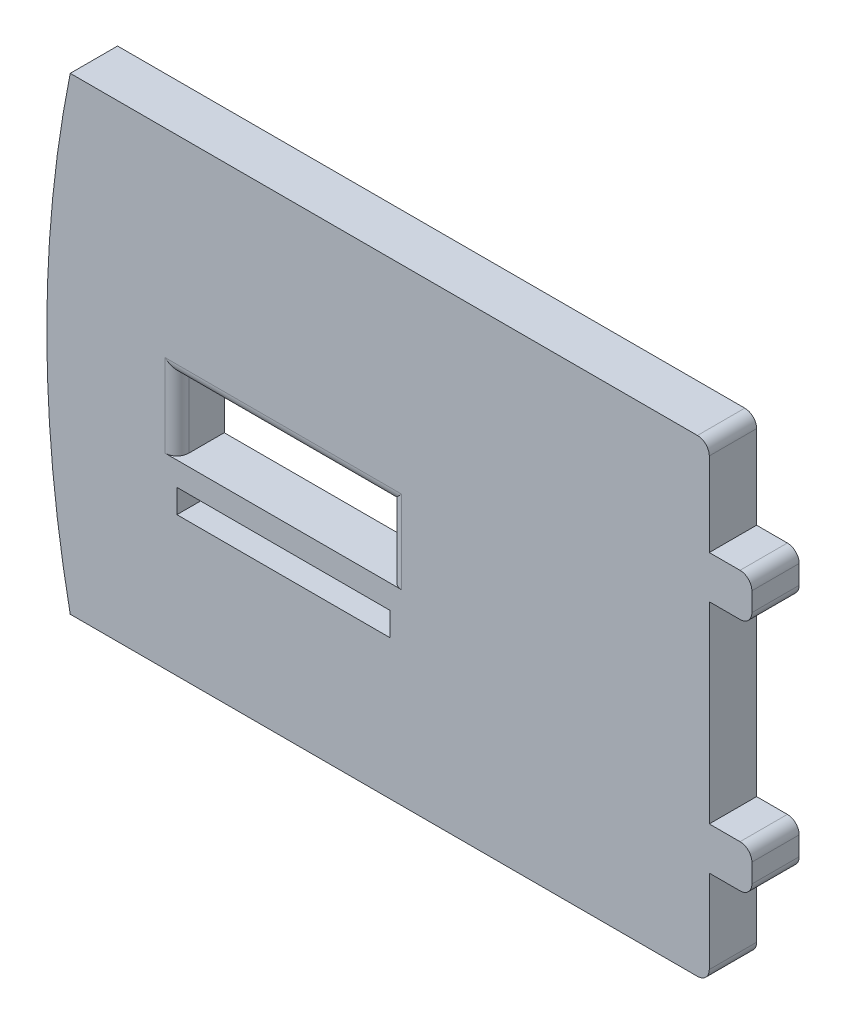
ISO-10303-21;
HEADER;
FILE_DESCRIPTION(('STEP AP214'),'2;1');
FILE_NAME('part.step','',(''),(''),'','','');
FILE_SCHEMA(('AUTOMOTIVE_DESIGN { 1 0 10303 214 1 1 1 1 }'));
ENDSEC;
DATA;
#1=APPLICATION_CONTEXT('core data for automotive mechanical design processes');
#2=APPLICATION_PROTOCOL_DEFINITION('international standard','automotive_design',2000,#1);
#3=PRODUCT_CONTEXT('',#1,'mechanical');
#4=PRODUCT('Part','Part','',(#3));
#5=PRODUCT_RELATED_PRODUCT_CATEGORY('part','',(#4));
#6=PRODUCT_DEFINITION_FORMATION('','',#4);
#7=PRODUCT_DEFINITION_CONTEXT('part definition',#1,'design');
#8=PRODUCT_DEFINITION('design','',#6,#7);
#9=PRODUCT_DEFINITION_SHAPE('','',#8);
#10=(LENGTH_UNIT() NAMED_UNIT(*) SI_UNIT(.MILLI.,.METRE.));
#11=(NAMED_UNIT(*) PLANE_ANGLE_UNIT() SI_UNIT($,.RADIAN.));
#12=(NAMED_UNIT(*) SI_UNIT($,.STERADIAN.) SOLID_ANGLE_UNIT());
#13=UNCERTAINTY_MEASURE_WITH_UNIT(LENGTH_MEASURE(1.E-05),#10,'distance_accuracy_value','');
#14=(GEOMETRIC_REPRESENTATION_CONTEXT(3) GLOBAL_UNCERTAINTY_ASSIGNED_CONTEXT((#13)) GLOBAL_UNIT_ASSIGNED_CONTEXT((#10,
#11,#12)) REPRESENTATION_CONTEXT('',''));
#15=CARTESIAN_POINT('',(0.,0.,0.));
#16=DIRECTION('',(0.,0.,1.));
#17=DIRECTION('',(1.,0.,0.));
#18=AXIS2_PLACEMENT_3D('',#15,#16,#17);
#19=CARTESIAN_POINT('',(-22.,0.,-2.));
#20=DIRECTION('',(-1.,0.,0.));
#21=DIRECTION('',(0.,0.,1.));
#22=AXIS2_PLACEMENT_3D('',#19,#20,#21);
#23=PLANE('',#22);
#24=DIRECTION('',(0.,-1.,0.));
#25=VECTOR('',#24,1.);
#26=CARTESIAN_POINT('',(-22.,0.,0.));
#27=LINE('',#26,#25);
#28=CARTESIAN_POINT('',(-22.,-5.86910715478513,0.));
#29=VERTEX_POINT('',#28);
#30=CARTESIAN_POINT('',(-22.,-9.4,0.));
#31=VERTEX_POINT('',#30);
#32=EDGE_CURVE('E247',#29,#31,#27,.T.);
#33=ORIENTED_EDGE('',*,*,#32,.T.);
#34=DIRECTION('',(0.,0.,1.));
#35=VECTOR('',#34,1.);
#36=CARTESIAN_POINT('',(-22.,-9.4,-2.));
#37=LINE('',#36,#35);
#38=CARTESIAN_POINT('',(-22.,-9.4,-2.));
#39=VERTEX_POINT('',#38);
#40=EDGE_CURVE('E69',#31,#39,#37,.F.);
#41=ORIENTED_EDGE('',*,*,#40,.T.);
#42=DIRECTION('',(0.,-1.,0.));
#43=VECTOR('',#42,1.);
#44=CARTESIAN_POINT('',(-22.,0.,-2.));
#45=LINE('',#44,#43);
#46=CARTESIAN_POINT('',(-22.,-5.86910715478513,-2.));
#47=VERTEX_POINT('',#46);
#48=EDGE_CURVE('E248',#47,#39,#45,.T.);
#49=ORIENTED_EDGE('',*,*,#48,.F.);
#50=DIRECTION('',(0.,0.,-1.));
#51=VECTOR('',#50,1.);
#52=CARTESIAN_POINT('',(-22.,-5.86910715478513,0.));
#53=LINE('',#52,#51);
#54=EDGE_CURVE('E237',#29,#47,#53,.T.);
#55=ORIENTED_EDGE('',*,*,#54,.F.);
#56=EDGE_LOOP('',(#33,#41,#49,#55));
#57=FACE_BOUND('',#56,.T.);
#58=ADVANCED_FACE('F43',(#57),#23,.F.);
#59=CARTESIAN_POINT('',(-22.,4.06420177177684,0.));
#60=VERTEX_POINT('',#59);
#61=CARTESIAN_POINT('',(-22.,-4.06910715478513,0.));
#62=VERTEX_POINT('',#61);
#63=EDGE_CURVE('E257',#60,#62,#27,.T.);
#64=ORIENTED_EDGE('',*,*,#63,.T.);
#65=DIRECTION('',(0.,0.,-1.));
#66=VECTOR('',#65,1.);
#67=CARTESIAN_POINT('',(-22.,-4.06910715478513,0.));
#68=LINE('',#67,#66);
#69=CARTESIAN_POINT('',(-22.,-4.06910715478513,-2.));
#70=VERTEX_POINT('',#69);
#71=EDGE_CURVE('E250',#62,#70,#68,.T.);
#72=ORIENTED_EDGE('',*,*,#71,.T.);
#73=CARTESIAN_POINT('',(-22.,4.06420177177684,-2.));
#74=VERTEX_POINT('',#73);
#75=EDGE_CURVE('E504',#74,#70,#45,.T.);
#76=ORIENTED_EDGE('',*,*,#75,.F.);
#77=DIRECTION('',(0.,0.,-1.));
#78=VECTOR('',#77,1.);
#79=CARTESIAN_POINT('',(-22.,4.06420177177684,0.));
#80=LINE('',#79,#78);
#81=EDGE_CURVE('E244',#60,#74,#80,.T.);
#82=ORIENTED_EDGE('',*,*,#81,.F.);
#83=EDGE_LOOP('',(#64,#72,#76,#82));
#84=FACE_BOUND('',#83,.T.);
#85=ADVANCED_FACE('F560',(#84),#23,.F.);
#86=CARTESIAN_POINT('',(0.,0.,0.));
#87=DIRECTION('',(0.,0.,1.));
#88=DIRECTION('',(1.,0.,0.));
#89=AXIS2_PLACEMENT_3D('',#86,#87,#88);
#90=PLANE('',#89);
#91=DIRECTION('',(0.,-1.,0.));
#92=VECTOR('',#91,1.);
#93=CARTESIAN_POINT('',(-35.,-2.00000000000001,0.));
#94=LINE('',#93,#92);
#95=CARTESIAN_POINT('',(-35.,1.5,0.));
#96=VERTEX_POINT('',#95);
#97=CARTESIAN_POINT('',(-35.,-2.00000000000001,0.));
#98=VERTEX_POINT('',#97);
#99=EDGE_CURVE('E324',#96,#98,#94,.T.);
#100=ORIENTED_EDGE('',*,*,#99,.T.);
#101=DIRECTION('',(-1.,0.,0.));
#102=VECTOR('',#101,1.);
#103=CARTESIAN_POINT('',(-44.5,-2.,0.));
#104=LINE('',#103,#102);
#105=CARTESIAN_POINT('',(-45.,-2.,0.));
#106=VERTEX_POINT('',#105);
#107=EDGE_CURVE('E429',#98,#106,#104,.T.);
#108=ORIENTED_EDGE('',*,*,#107,.T.);
#109=DIRECTION('',(0.,1.,0.));
#110=VECTOR('',#109,1.);
#111=CARTESIAN_POINT('',(-45.,0.999999999999996,0.));
#112=LINE('',#111,#110);
#113=CARTESIAN_POINT('',(-45.,1.5,0.));
#114=VERTEX_POINT('',#113);
#115=EDGE_CURVE('E321',#106,#114,#112,.T.);
#116=ORIENTED_EDGE('',*,*,#115,.T.);
#117=DIRECTION('',(1.,0.,0.));
#118=VECTOR('',#117,1.);
#119=CARTESIAN_POINT('',(-35.5,1.5,0.));
#120=LINE('',#119,#118);
#121=EDGE_CURVE('E318',#114,#96,#120,.T.);
#122=ORIENTED_EDGE('',*,*,#121,.T.);
#123=EDGE_LOOP('',(#100,#108,#116,#122));
#124=FACE_BOUND('',#123,.T.);
#125=DIRECTION('',(-1.,0.,0.));
#126=VECTOR('',#125,1.);
#127=CARTESIAN_POINT('',(-35.5,-4.,0.));
#128=LINE('',#127,#126);
#129=CARTESIAN_POINT('',(-35.5,-4.,0.));
#130=VERTEX_POINT('',#129);
#131=CARTESIAN_POINT('',(-44.5,-4.00000000000001,0.));
#132=VERTEX_POINT('',#131);
#133=EDGE_CURVE('E458',#130,#132,#128,.T.);
#134=ORIENTED_EDGE('',*,*,#133,.T.);
#135=DIRECTION('',(0.,1.,0.));
#136=VECTOR('',#135,1.);
#137=CARTESIAN_POINT('',(-44.5,-4.00000000000001,0.));
#138=LINE('',#137,#136);
#139=CARTESIAN_POINT('',(-44.5,-3.00000000000001,0.));
#140=VERTEX_POINT('',#139);
#141=EDGE_CURVE('E462',#132,#140,#138,.T.);
#142=ORIENTED_EDGE('',*,*,#141,.T.);
#143=DIRECTION('',(1.,0.,0.));
#144=VECTOR('',#143,1.);
#145=CARTESIAN_POINT('',(-44.5,-3.00000000000001,0.));
#146=LINE('',#145,#144);
#147=CARTESIAN_POINT('',(-35.5,-3.00000000000001,0.));
#148=VERTEX_POINT('',#147);
#149=EDGE_CURVE('E467',#140,#148,#146,.T.);
#150=ORIENTED_EDGE('',*,*,#149,.T.);
#151=DIRECTION('',(0.,-1.,0.));
#152=VECTOR('',#151,1.);
#153=CARTESIAN_POINT('',(-35.5,-3.00000000000001,0.));
#154=LINE('',#153,#152);
#155=EDGE_CURVE('E471',#148,#130,#154,.T.);
#156=ORIENTED_EDGE('',*,*,#155,.T.);
#157=EDGE_LOOP('',(#134,#142,#150,#156));
#158=FACE_BOUND('',#157,.T.);
#159=DIRECTION('',(0.,-1.,0.));
#160=VECTOR('',#159,1.);
#161=CARTESIAN_POINT('',(-20.2,0.,0.));
#162=LINE('',#161,#160);
#163=CARTESIAN_POINT('',(-20.2,-4.56910715478513,0.));
#164=VERTEX_POINT('',#163);
#165=CARTESIAN_POINT('',(-20.2,-5.36910715478513,0.));
#166=VERTEX_POINT('',#165);
#167=EDGE_CURVE('E575',#164,#166,#162,.T.);
#168=ORIENTED_EDGE('',*,*,#167,.F.);
#169=CARTESIAN_POINT('',(-20.7,-4.56910715478513,0.));
#170=DIRECTION('',(0.,0.,1.));
#171=DIRECTION('',(1.,0.,0.));
#172=AXIS2_PLACEMENT_3D('',#169,#170,#171);
#173=CIRCLE('',#172,0.5);
#174=CARTESIAN_POINT('',(-20.7,-4.06910715478513,0.));
#175=VERTEX_POINT('',#174);
#176=EDGE_CURVE('E315',#164,#175,#173,.T.);
#177=ORIENTED_EDGE('',*,*,#176,.T.);
#178=DIRECTION('',(-1.,0.,0.));
#179=VECTOR('',#178,1.);
#180=CARTESIAN_POINT('',(-20.2,-4.06910715478513,0.));
#181=LINE('',#180,#179);
#182=EDGE_CURVE('E564',#175,#62,#181,.T.);
#183=ORIENTED_EDGE('',*,*,#182,.T.);
#184=ORIENTED_EDGE('',*,*,#63,.F.);
#185=DIRECTION('',(-1.,0.,0.));
#186=VECTOR('',#185,1.);
#187=CARTESIAN_POINT('',(-20.2,4.06420177177684,0.));
#188=LINE('',#187,#186);
#189=CARTESIAN_POINT('',(-20.7,4.06420177177684,0.));
#190=VERTEX_POINT('',#189);
#191=EDGE_CURVE('E480',#190,#60,#188,.T.);
#192=ORIENTED_EDGE('',*,*,#191,.F.);
#193=CARTESIAN_POINT('',(-20.7,4.56420177177684,0.));
#194=DIRECTION('',(0.,0.,1.));
#195=DIRECTION('',(1.,0.,0.));
#196=AXIS2_PLACEMENT_3D('',#193,#194,#195);
#197=CIRCLE('',#196,0.5);
#198=CARTESIAN_POINT('',(-20.2,4.56420177177684,0.));
#199=VERTEX_POINT('',#198);
#200=EDGE_CURVE('E307',#190,#199,#197,.T.);
#201=ORIENTED_EDGE('',*,*,#200,.T.);
#202=DIRECTION('',(0.,-1.,0.));
#203=VECTOR('',#202,1.);
#204=CARTESIAN_POINT('',(-20.2,0.,0.));
#205=LINE('',#204,#203);
#206=CARTESIAN_POINT('',(-20.2,5.36420177177684,0.));
#207=VERTEX_POINT('',#206);
#208=EDGE_CURVE('E530',#207,#199,#205,.T.);
#209=ORIENTED_EDGE('',*,*,#208,.F.);
#210=CARTESIAN_POINT('',(-20.7,5.36420177177684,0.));
#211=DIRECTION('',(0.,0.,1.));
#212=DIRECTION('',(1.,0.,0.));
#213=AXIS2_PLACEMENT_3D('',#210,#211,#212);
#214=CIRCLE('',#213,0.5);
#215=CARTESIAN_POINT('',(-20.7,5.86420177177684,0.));
#216=VERTEX_POINT('',#215);
#217=EDGE_CURVE('E304',#207,#216,#214,.T.);
#218=ORIENTED_EDGE('',*,*,#217,.T.);
#219=DIRECTION('',(-1.,0.,0.));
#220=VECTOR('',#219,1.);
#221=CARTESIAN_POINT('',(-20.2,5.86420177177684,0.));
#222=LINE('',#221,#220);
#223=CARTESIAN_POINT('',(-22.,5.86420177177684,0.));
#224=VERTEX_POINT('',#223);
#225=EDGE_CURVE('E541',#216,#224,#222,.T.);
#226=ORIENTED_EDGE('',*,*,#225,.T.);
#227=CARTESIAN_POINT('',(-22.,9.4,0.));
#228=VERTEX_POINT('',#227);
#229=EDGE_CURVE('E260',#228,#224,#27,.T.);
#230=ORIENTED_EDGE('',*,*,#229,.F.);
#231=CARTESIAN_POINT('',(-22.5,9.4,0.));
#232=DIRECTION('',(0.,0.,1.));
#233=DIRECTION('',(1.,0.,0.));
#234=AXIS2_PLACEMENT_3D('',#231,#232,#233);
#235=CIRCLE('',#234,0.5);
#236=CARTESIAN_POINT('',(-22.5,9.9,0.));
#237=VERTEX_POINT('',#236);
#238=EDGE_CURVE('E298',#228,#237,#235,.T.);
#239=ORIENTED_EDGE('',*,*,#238,.T.);
#240=DIRECTION('',(-1.,0.,0.));
#241=VECTOR('',#240,1.);
#242=CARTESIAN_POINT('',(0.,9.9,0.));
#243=LINE('',#242,#241);
#244=CARTESIAN_POINT('',(-49.0101009996919,9.9,0.));
#245=VERTEX_POINT('',#244);
#246=EDGE_CURVE('E277',#237,#245,#243,.T.);
#247=ORIENTED_EDGE('',*,*,#246,.T.);
#248=CARTESIAN_POINT('',(0.,0.,0.));
#249=DIRECTION('',(0.,0.,1.));
#250=DIRECTION('',(1.,0.,0.));
#251=AXIS2_PLACEMENT_3D('',#248,#249,#250);
#252=CIRCLE('',#251,50.);
#253=CARTESIAN_POINT('',(-49.0101009996919,-9.9,0.));
#254=VERTEX_POINT('',#253);
#255=EDGE_CURVE('E294',#245,#254,#252,.T.);
#256=ORIENTED_EDGE('',*,*,#255,.T.);
#257=DIRECTION('',(-1.,0.,0.));
#258=VECTOR('',#257,1.);
#259=CARTESIAN_POINT('',(0.,-9.9,0.));
#260=LINE('',#259,#258);
#261=CARTESIAN_POINT('',(-22.5,-9.9,0.));
#262=VERTEX_POINT('',#261);
#263=EDGE_CURVE('E270',#262,#254,#260,.T.);
#264=ORIENTED_EDGE('',*,*,#263,.F.);
#265=CARTESIAN_POINT('',(-22.5,-9.4,0.));
#266=DIRECTION('',(0.,0.,1.));
#267=DIRECTION('',(1.,0.,0.));
#268=AXIS2_PLACEMENT_3D('',#265,#266,#267);
#269=CIRCLE('',#268,0.5);
#270=EDGE_CURVE('E255',#262,#31,#269,.T.);
#271=ORIENTED_EDGE('',*,*,#270,.T.);
#272=ORIENTED_EDGE('',*,*,#32,.F.);
#273=DIRECTION('',(-1.,0.,0.));
#274=VECTOR('',#273,1.);
#275=CARTESIAN_POINT('',(-20.2,-5.86910715478513,0.));
#276=LINE('',#275,#274);
#277=CARTESIAN_POINT('',(-20.7,-5.86910715478513,0.));
#278=VERTEX_POINT('',#277);
#279=EDGE_CURVE('E233',#278,#29,#276,.T.);
#280=ORIENTED_EDGE('',*,*,#279,.F.);
#281=CARTESIAN_POINT('',(-20.7,-5.36910715478513,0.));
#282=DIRECTION('',(0.,0.,1.));
#283=DIRECTION('',(1.,0.,0.));
#284=AXIS2_PLACEMENT_3D('',#281,#282,#283);
#285=CIRCLE('',#284,0.5);
#286=EDGE_CURVE('E312',#278,#166,#285,.T.);
#287=ORIENTED_EDGE('',*,*,#286,.T.);
#288=EDGE_LOOP('',(#168,#177,#183,#184,#192,#201,#209,#218,#226,#230,#239,#247,#256,#264,#271,
#272,#280,#287));
#289=FACE_BOUND('',#288,.T.);
#290=ADVANCED_FACE('F253',(#124,#158,#289),#90,.T.);
#291=CARTESIAN_POINT('',(0.,0.,-2.));
#292=DIRECTION('',(0.,0.,1.));
#293=DIRECTION('',(1.,0.,0.));
#294=AXIS2_PLACEMENT_3D('',#291,#292,#293);
#295=CYLINDRICAL_SURFACE('',#294,50.);
#296=ORIENTED_EDGE('',*,*,#255,.F.);
#297=DIRECTION('',(0.,0.,1.));
#298=VECTOR('',#297,1.);
#299=CARTESIAN_POINT('',(-49.0101009996919,9.9,-2.));
#300=LINE('',#299,#298);
#301=CARTESIAN_POINT('',(-49.0101009996919,9.9,-2.));
#302=VERTEX_POINT('',#301);
#303=EDGE_CURVE('E285',#302,#245,#300,.T.);
#304=ORIENTED_EDGE('',*,*,#303,.F.);
#305=CARTESIAN_POINT('',(0.,0.,-2.));
#306=DIRECTION('',(0.,0.,1.));
#307=DIRECTION('',(1.,0.,0.));
#308=AXIS2_PLACEMENT_3D('',#305,#306,#307);
#309=CIRCLE('',#308,50.);
#310=CARTESIAN_POINT('',(-49.0101009996919,-9.9,-2.));
#311=VERTEX_POINT('',#310);
#312=EDGE_CURVE('E289',#302,#311,#309,.T.);
#313=ORIENTED_EDGE('',*,*,#312,.T.);
#314=DIRECTION('',(0.,0.,1.));
#315=VECTOR('',#314,1.);
#316=CARTESIAN_POINT('',(-49.0101009996919,-9.9,-2.));
#317=LINE('',#316,#315);
#318=EDGE_CURVE('E290',#311,#254,#317,.T.);
#319=ORIENTED_EDGE('',*,*,#318,.T.);
#320=EDGE_LOOP('',(#296,#304,#313,#319));
#321=FACE_BOUND('',#320,.T.);
#322=ADVANCED_FACE('F517',(#321),#295,.T.);
#323=CARTESIAN_POINT('',(0.,0.,-2.));
#324=DIRECTION('',(0.,0.,1.));
#325=DIRECTION('',(1.,0.,0.));
#326=AXIS2_PLACEMENT_3D('',#323,#324,#325);
#327=PLANE('',#326);
#328=DIRECTION('',(1.,0.,0.));
#329=VECTOR('',#328,1.);
#330=CARTESIAN_POINT('',(-35.5,0.999999999999996,-2.));
#331=LINE('',#330,#329);
#332=CARTESIAN_POINT('',(-44.5,0.999999999999996,-2.));
#333=VERTEX_POINT('',#332);
#334=CARTESIAN_POINT('',(-35.5,0.999999999999996,-2.));
#335=VERTEX_POINT('',#334);
#336=EDGE_CURVE('E437',#333,#335,#331,.T.);
#337=ORIENTED_EDGE('',*,*,#336,.F.);
#338=DIRECTION('',(0.,1.,0.));
#339=VECTOR('',#338,1.);
#340=CARTESIAN_POINT('',(-44.5,0.999999999999996,-2.));
#341=LINE('',#340,#339);
#342=CARTESIAN_POINT('',(-44.5,-2.,-2.));
#343=VERTEX_POINT('',#342);
#344=EDGE_CURVE('E433',#343,#333,#341,.T.);
#345=ORIENTED_EDGE('',*,*,#344,.F.);
#346=DIRECTION('',(-1.,0.,0.));
#347=VECTOR('',#346,1.);
#348=CARTESIAN_POINT('',(-44.5,-2.,-2.));
#349=LINE('',#348,#347);
#350=CARTESIAN_POINT('',(-35.5,-2.00000000000001,-2.));
#351=VERTEX_POINT('',#350);
#352=EDGE_CURVE('E422',#351,#343,#349,.T.);
#353=ORIENTED_EDGE('',*,*,#352,.F.);
#354=DIRECTION('',(0.,-1.,0.));
#355=VECTOR('',#354,1.);
#356=CARTESIAN_POINT('',(-35.5,-2.00000000000001,-2.));
#357=LINE('',#356,#355);
#358=EDGE_CURVE('E430',#335,#351,#357,.T.);
#359=ORIENTED_EDGE('',*,*,#358,.F.);
#360=EDGE_LOOP('',(#337,#345,#353,#359));
#361=FACE_BOUND('',#360,.T.);
#362=DIRECTION('',(0.,1.,0.));
#363=VECTOR('',#362,1.);
#364=CARTESIAN_POINT('',(-44.5,-4.00000000000001,-2.));
#365=LINE('',#364,#363);
#366=CARTESIAN_POINT('',(-44.5,-4.00000000000001,-2.));
#367=VERTEX_POINT('',#366);
#368=CARTESIAN_POINT('',(-44.5,-3.00000000000001,-2.));
#369=VERTEX_POINT('',#368);
#370=EDGE_CURVE('E479',#367,#369,#365,.T.);
#371=ORIENTED_EDGE('',*,*,#370,.F.);
#372=DIRECTION('',(-1.,0.,0.));
#373=VECTOR('',#372,1.);
#374=CARTESIAN_POINT('',(-35.5,-4.,-2.));
#375=LINE('',#374,#373);
#376=CARTESIAN_POINT('',(-35.5,-4.,-2.));
#377=VERTEX_POINT('',#376);
#378=EDGE_CURVE('E476',#377,#367,#375,.T.);
#379=ORIENTED_EDGE('',*,*,#378,.F.);
#380=DIRECTION('',(0.,-1.,0.));
#381=VECTOR('',#380,1.);
#382=CARTESIAN_POINT('',(-35.5,-3.00000000000001,-2.));
#383=LINE('',#382,#381);
#384=CARTESIAN_POINT('',(-35.5,-3.00000000000001,-2.));
#385=VERTEX_POINT('',#384);
#386=EDGE_CURVE('E463',#385,#377,#383,.T.);
#387=ORIENTED_EDGE('',*,*,#386,.F.);
#388=DIRECTION('',(1.,0.,0.));
#389=VECTOR('',#388,1.);
#390=CARTESIAN_POINT('',(-44.5,-3.00000000000001,-2.));
#391=LINE('',#390,#389);
#392=EDGE_CURVE('E484',#369,#385,#391,.T.);
#393=ORIENTED_EDGE('',*,*,#392,.F.);
#394=EDGE_LOOP('',(#371,#379,#387,#393));
#395=FACE_BOUND('',#394,.T.);
#396=DIRECTION('',(-1.,0.,0.));
#397=VECTOR('',#396,1.);
#398=CARTESIAN_POINT('',(-20.2,-4.06910715478513,-2.));
#399=LINE('',#398,#397);
#400=CARTESIAN_POINT('',(-20.7,-4.06910715478513,-2.));
#401=VERTEX_POINT('',#400);
#402=EDGE_CURVE('E570',#401,#70,#399,.T.);
#403=ORIENTED_EDGE('',*,*,#402,.F.);
#404=CARTESIAN_POINT('',(-20.7,-4.56910715478513,-2.));
#405=DIRECTION('',(0.,0.,1.));
#406=DIRECTION('',(1.,0.,0.));
#407=AXIS2_PLACEMENT_3D('',#404,#405,#406);
#408=CIRCLE('',#407,0.5);
#409=CARTESIAN_POINT('',(-20.2,-4.56910715478513,-2.));
#410=VERTEX_POINT('',#409);
#411=EDGE_CURVE('E355',#401,#410,#408,.F.);
#412=ORIENTED_EDGE('',*,*,#411,.T.);
#413=DIRECTION('',(0.,1.,0.));
#414=VECTOR('',#413,1.);
#415=CARTESIAN_POINT('',(-20.2,0.,-2.));
#416=LINE('',#415,#414);
#417=CARTESIAN_POINT('',(-20.2,-5.36910715478513,-2.));
#418=VERTEX_POINT('',#417);
#419=EDGE_CURVE('E571',#418,#410,#416,.T.);
#420=ORIENTED_EDGE('',*,*,#419,.F.);
#421=CARTESIAN_POINT('',(-20.7,-5.36910715478513,-2.));
#422=DIRECTION('',(0.,0.,1.));
#423=DIRECTION('',(1.,0.,0.));
#424=AXIS2_PLACEMENT_3D('',#421,#422,#423);
#425=CIRCLE('',#424,0.5);
#426=CARTESIAN_POINT('',(-20.7,-5.86910715478513,-2.));
#427=VERTEX_POINT('',#426);
#428=EDGE_CURVE('E352',#418,#427,#425,.F.);
#429=ORIENTED_EDGE('',*,*,#428,.T.);
#430=DIRECTION('',(-1.,0.,0.));
#431=VECTOR('',#430,1.);
#432=CARTESIAN_POINT('',(-20.2,-5.86910715478513,-2.));
#433=LINE('',#432,#431);
#434=EDGE_CURVE('E245',#427,#47,#433,.T.);
#435=ORIENTED_EDGE('',*,*,#434,.T.);
#436=ORIENTED_EDGE('',*,*,#48,.T.);
#437=CARTESIAN_POINT('',(-22.5,-9.4,-2.));
#438=DIRECTION('',(0.,0.,1.));
#439=DIRECTION('',(1.,0.,0.));
#440=AXIS2_PLACEMENT_3D('',#437,#438,#439);
#441=CIRCLE('',#440,0.5);
#442=CARTESIAN_POINT('',(-22.5,-9.9,-2.));
#443=VERTEX_POINT('',#442);
#444=EDGE_CURVE('E61',#39,#443,#441,.F.);
#445=ORIENTED_EDGE('',*,*,#444,.T.);
#446=DIRECTION('',(-1.,0.,0.));
#447=VECTOR('',#446,1.);
#448=CARTESIAN_POINT('',(0.,-9.9,-2.));
#449=LINE('',#448,#447);
#450=EDGE_CURVE('E503',#443,#311,#449,.T.);
#451=ORIENTED_EDGE('',*,*,#450,.T.);
#452=ORIENTED_EDGE('',*,*,#312,.F.);
#453=DIRECTION('',(-1.,0.,0.));
#454=VECTOR('',#453,1.);
#455=CARTESIAN_POINT('',(0.,9.9,-2.));
#456=LINE('',#455,#454);
#457=CARTESIAN_POINT('',(-22.5,9.9,-2.));
#458=VERTEX_POINT('',#457);
#459=EDGE_CURVE('E293',#458,#302,#456,.T.);
#460=ORIENTED_EDGE('',*,*,#459,.F.);
#461=CARTESIAN_POINT('',(-22.5,9.4,-2.));
#462=DIRECTION('',(0.,0.,1.));
#463=DIRECTION('',(1.,0.,0.));
#464=AXIS2_PLACEMENT_3D('',#461,#462,#463);
#465=CIRCLE('',#464,0.5);
#466=CARTESIAN_POINT('',(-22.,9.4,-2.));
#467=VERTEX_POINT('',#466);
#468=EDGE_CURVE('E341',#458,#467,#465,.F.);
#469=ORIENTED_EDGE('',*,*,#468,.T.);
#470=CARTESIAN_POINT('',(-22.,5.86420177177684,-2.));
#471=VERTEX_POINT('',#470);
#472=EDGE_CURVE('E499',#467,#471,#45,.T.);
#473=ORIENTED_EDGE('',*,*,#472,.T.);
#474=DIRECTION('',(-1.,0.,0.));
#475=VECTOR('',#474,1.);
#476=CARTESIAN_POINT('',(-20.2,5.86420177177684,-2.));
#477=LINE('',#476,#475);
#478=CARTESIAN_POINT('',(-20.7,5.86420177177684,-2.));
#479=VERTEX_POINT('',#478);
#480=EDGE_CURVE('E544',#479,#471,#477,.T.);
#481=ORIENTED_EDGE('',*,*,#480,.F.);
#482=CARTESIAN_POINT('',(-20.7,5.36420177177684,-2.));
#483=DIRECTION('',(0.,0.,1.));
#484=DIRECTION('',(1.,0.,0.));
#485=AXIS2_PLACEMENT_3D('',#482,#483,#484);
#486=CIRCLE('',#485,0.5);
#487=CARTESIAN_POINT('',(-20.2,5.36420177177684,-2.));
#488=VERTEX_POINT('',#487);
#489=EDGE_CURVE('E344',#479,#488,#486,.F.);
#490=ORIENTED_EDGE('',*,*,#489,.T.);
#491=DIRECTION('',(0.,1.,0.));
#492=VECTOR('',#491,1.);
#493=CARTESIAN_POINT('',(-20.2,0.,-2.));
#494=LINE('',#493,#492);
#495=CARTESIAN_POINT('',(-20.2,4.56420177177684,-2.));
#496=VERTEX_POINT('',#495);
#497=EDGE_CURVE('E535',#496,#488,#494,.T.);
#498=ORIENTED_EDGE('',*,*,#497,.F.);
#499=CARTESIAN_POINT('',(-20.7,4.56420177177684,-2.));
#500=DIRECTION('',(0.,0.,1.));
#501=DIRECTION('',(1.,0.,0.));
#502=AXIS2_PLACEMENT_3D('',#499,#500,#501);
#503=CIRCLE('',#502,0.5);
#504=CARTESIAN_POINT('',(-20.7,4.06420177177684,-2.));
#505=VERTEX_POINT('',#504);
#506=EDGE_CURVE('E347',#496,#505,#503,.F.);
#507=ORIENTED_EDGE('',*,*,#506,.T.);
#508=DIRECTION('',(-1.,0.,0.));
#509=VECTOR('',#508,1.);
#510=CARTESIAN_POINT('',(-20.2,4.06420177177684,-2.));
#511=LINE('',#510,#509);
#512=EDGE_CURVE('E547',#505,#74,#511,.T.);
#513=ORIENTED_EDGE('',*,*,#512,.T.);
#514=ORIENTED_EDGE('',*,*,#75,.T.);
#515=EDGE_LOOP('',(#403,#412,#420,#429,#435,#436,#445,#451,#452,#460,#469,#473,#481,#490,#498,
#507,#513,#514));
#516=FACE_BOUND('',#515,.T.);
#517=ADVANCED_FACE('F434',(#361,#395,#516),#327,.F.);
#518=ORIENTED_EDGE('',*,*,#472,.F.);
#519=DIRECTION('',(0.,0.,1.));
#520=VECTOR('',#519,1.);
#521=CARTESIAN_POINT('',(-22.,9.4,0.));
#522=LINE('',#521,#520);
#523=EDGE_CURVE('E386',#467,#228,#522,.T.);
#524=ORIENTED_EDGE('',*,*,#523,.T.);
#525=ORIENTED_EDGE('',*,*,#229,.T.);
#526=DIRECTION('',(0.,0.,-1.));
#527=VECTOR('',#526,1.);
#528=CARTESIAN_POINT('',(-22.,5.86420177177684,0.));
#529=LINE('',#528,#527);
#530=EDGE_CURVE('E526',#224,#471,#529,.T.);
#531=ORIENTED_EDGE('',*,*,#530,.T.);
#532=EDGE_LOOP('',(#518,#524,#525,#531));
#533=FACE_BOUND('',#532,.T.);
#534=ADVANCED_FACE('F525',(#533),#23,.F.);
#535=CARTESIAN_POINT('',(0.,9.9,-2.));
#536=DIRECTION('',(0.,1.,0.));
#537=DIRECTION('',(0.,0.,1.));
#538=AXIS2_PLACEMENT_3D('',#535,#536,#537);
#539=PLANE('',#538);
#540=ORIENTED_EDGE('',*,*,#246,.F.);
#541=DIRECTION('',(0.,0.,1.));
#542=VECTOR('',#541,1.);
#543=CARTESIAN_POINT('',(-22.5,9.9,-2.));
#544=LINE('',#543,#542);
#545=EDGE_CURVE('E389',#237,#458,#544,.F.);
#546=ORIENTED_EDGE('',*,*,#545,.T.);
#547=ORIENTED_EDGE('',*,*,#459,.T.);
#548=ORIENTED_EDGE('',*,*,#303,.T.);
#549=EDGE_LOOP('',(#540,#546,#547,#548));
#550=FACE_BOUND('',#549,.T.);
#551=ADVANCED_FACE('F511',(#550),#539,.T.);
#552=CARTESIAN_POINT('',(0.,-9.9,-2.));
#553=DIRECTION('',(0.,1.,0.));
#554=DIRECTION('',(0.,0.,1.));
#555=AXIS2_PLACEMENT_3D('',#552,#553,#554);
#556=PLANE('',#555);
#557=ORIENTED_EDGE('',*,*,#450,.F.);
#558=DIRECTION('',(0.,0.,1.));
#559=VECTOR('',#558,1.);
#560=CARTESIAN_POINT('',(-22.5,-9.9,-2.));
#561=LINE('',#560,#559);
#562=EDGE_CURVE('E367',#443,#262,#561,.T.);
#563=ORIENTED_EDGE('',*,*,#562,.T.);
#564=ORIENTED_EDGE('',*,*,#263,.T.);
#565=ORIENTED_EDGE('',*,*,#318,.F.);
#566=EDGE_LOOP('',(#557,#563,#564,#565));
#567=FACE_BOUND('',#566,.T.);
#568=ADVANCED_FACE('F520',(#567),#556,.F.);
#569=CARTESIAN_POINT('',(-35.5,-4.,0.));
#570=DIRECTION('',(0.,-1.,0.));
#571=DIRECTION('',(1.,0.,0.));
#572=AXIS2_PLACEMENT_3D('',#569,#570,#571);
#573=PLANE('',#572);
#574=ORIENTED_EDGE('',*,*,#378,.T.);
#575=DIRECTION('',(0.,0.,-1.));
#576=VECTOR('',#575,1.);
#577=CARTESIAN_POINT('',(-44.5,-4.00000000000001,0.));
#578=LINE('',#577,#576);
#579=EDGE_CURVE('E475',#132,#367,#578,.T.);
#580=ORIENTED_EDGE('',*,*,#579,.F.);
#581=ORIENTED_EDGE('',*,*,#133,.F.);
#582=DIRECTION('',(0.,0.,-1.));
#583=VECTOR('',#582,1.);
#584=CARTESIAN_POINT('',(-35.5,-4.,0.));
#585=LINE('',#584,#583);
#586=EDGE_CURVE('E439',#130,#377,#585,.T.);
#587=ORIENTED_EDGE('',*,*,#586,.T.);
#588=EDGE_LOOP('',(#574,#580,#581,#587));
#589=FACE_BOUND('',#588,.T.);
#590=ADVANCED_FACE('F791',(#589),#573,.F.);
#591=CARTESIAN_POINT('',(-35.5,-3.00000000000001,0.));
#592=DIRECTION('',(1.,0.,0.));
#593=DIRECTION('',(0.,0.,-1.));
#594=AXIS2_PLACEMENT_3D('',#591,#592,#593);
#595=PLANE('',#594);
#596=ORIENTED_EDGE('',*,*,#386,.T.);
#597=ORIENTED_EDGE('',*,*,#586,.F.);
#598=ORIENTED_EDGE('',*,*,#155,.F.);
#599=DIRECTION('',(0.,0.,-1.));
#600=VECTOR('',#599,1.);
#601=CARTESIAN_POINT('',(-35.5,-3.00000000000001,0.));
#602=LINE('',#601,#600);
#603=EDGE_CURVE('E444',#148,#385,#602,.T.);
#604=ORIENTED_EDGE('',*,*,#603,.T.);
#605=EDGE_LOOP('',(#596,#597,#598,#604));
#606=FACE_BOUND('',#605,.T.);
#607=ADVANCED_FACE('F844',(#606),#595,.F.);
#608=CARTESIAN_POINT('',(-44.5,-3.00000000000001,0.));
#609=DIRECTION('',(0.,1.,0.));
#610=DIRECTION('',(0.,0.,1.));
#611=AXIS2_PLACEMENT_3D('',#608,#609,#610);
#612=PLANE('',#611);
#613=ORIENTED_EDGE('',*,*,#392,.T.);
#614=ORIENTED_EDGE('',*,*,#603,.F.);
#615=ORIENTED_EDGE('',*,*,#149,.F.);
#616=DIRECTION('',(0.,0.,-1.));
#617=VECTOR('',#616,1.);
#618=CARTESIAN_POINT('',(-44.5,-3.00000000000001,0.));
#619=LINE('',#618,#617);
#620=EDGE_CURVE('E493',#140,#369,#619,.T.);
#621=ORIENTED_EDGE('',*,*,#620,.T.);
#622=EDGE_LOOP('',(#613,#614,#615,#621));
#623=FACE_BOUND('',#622,.T.);
#624=ADVANCED_FACE('F834',(#623),#612,.F.);
#625=CARTESIAN_POINT('',(-44.5,-4.00000000000001,0.));
#626=DIRECTION('',(-1.,0.,0.));
#627=DIRECTION('',(0.,0.,1.));
#628=AXIS2_PLACEMENT_3D('',#625,#626,#627);
#629=PLANE('',#628);
#630=ORIENTED_EDGE('',*,*,#370,.T.);
#631=ORIENTED_EDGE('',*,*,#620,.F.);
#632=ORIENTED_EDGE('',*,*,#141,.F.);
#633=ORIENTED_EDGE('',*,*,#579,.T.);
#634=EDGE_LOOP('',(#630,#631,#632,#633));
#635=FACE_BOUND('',#634,.T.);
#636=ADVANCED_FACE('F780',(#635),#629,.F.);
#637=CARTESIAN_POINT('',(-44.5,0.999999999999996,0.));
#638=DIRECTION('',(-1.,0.,0.));
#639=DIRECTION('',(0.,0.,1.));
#640=AXIS2_PLACEMENT_3D('',#637,#638,#639);
#641=PLANE('',#640);
#642=DIRECTION('',(0.,0.,-1.));
#643=VECTOR('',#642,1.);
#644=CARTESIAN_POINT('',(-44.5,0.999999999999996,0.));
#645=LINE('',#644,#643);
#646=CARTESIAN_POINT('',(-44.5,0.999999999999996,-0.5));
#647=VERTEX_POINT('',#646);
#648=EDGE_CURVE('E418',#647,#333,#645,.T.);
#649=ORIENTED_EDGE('',*,*,#648,.F.);
#650=DIRECTION('',(0.,1.,0.));
#651=VECTOR('',#650,1.);
#652=CARTESIAN_POINT('',(-44.5,-2.,-0.5));
#653=LINE('',#652,#651);
#654=CARTESIAN_POINT('',(-44.5,-2.,-0.5));
#655=VERTEX_POINT('',#654);
#656=EDGE_CURVE('E331',#647,#655,#653,.F.);
#657=ORIENTED_EDGE('',*,*,#656,.T.);
#658=DIRECTION('',(0.,0.,-1.));
#659=VECTOR('',#658,1.);
#660=CARTESIAN_POINT('',(-44.5,-2.,0.));
#661=LINE('',#660,#659);
#662=EDGE_CURVE('E258',#655,#343,#661,.T.);
#663=ORIENTED_EDGE('',*,*,#662,.T.);
#664=ORIENTED_EDGE('',*,*,#344,.T.);
#665=EDGE_LOOP('',(#649,#657,#663,#664));
#666=FACE_BOUND('',#665,.T.);
#667=ADVANCED_FACE('F415',(#666),#641,.F.);
#668=CARTESIAN_POINT('',(-44.5,-2.,0.));
#669=DIRECTION('',(0.,-1.,0.));
#670=DIRECTION('',(1.,0.,0.));
#671=AXIS2_PLACEMENT_3D('',#668,#669,#670);
#672=PLANE('',#671);
#673=ORIENTED_EDGE('',*,*,#352,.T.);
#674=ORIENTED_EDGE('',*,*,#662,.F.);
#675=CARTESIAN_POINT('',(-45.,-2.,-0.5));
#676=DIRECTION('',(0.,-1.,0.));
#677=DIRECTION('',(1.,0.,0.));
#678=AXIS2_PLACEMENT_3D('',#675,#676,#677);
#679=CIRCLE('',#678,0.5);
#680=EDGE_CURVE('E11',#655,#106,#679,.T.);
#681=ORIENTED_EDGE('',*,*,#680,.T.);
#682=ORIENTED_EDGE('',*,*,#107,.F.);
#683=CARTESIAN_POINT('',(-35.,-2.00000000000001,-0.5));
#684=DIRECTION('',(0.,-1.,0.));
#685=DIRECTION('',(1.,0.,0.));
#686=AXIS2_PLACEMENT_3D('',#683,#684,#685);
#687=CIRCLE('',#686,0.5);
#688=CARTESIAN_POINT('',(-35.5,-2.00000000000001,-0.5));
#689=VERTEX_POINT('',#688);
#690=EDGE_CURVE('E53',#98,#689,#687,.T.);
#691=ORIENTED_EDGE('',*,*,#690,.T.);
#692=DIRECTION('',(0.,0.,-1.));
#693=VECTOR('',#692,1.);
#694=CARTESIAN_POINT('',(-35.5,-2.00000000000001,0.));
#695=LINE('',#694,#693);
#696=EDGE_CURVE('E264',#689,#351,#695,.T.);
#697=ORIENTED_EDGE('',*,*,#696,.T.);
#698=EDGE_LOOP('',(#673,#674,#681,#682,#691,#697));
#699=FACE_BOUND('',#698,.T.);
#700=ADVANCED_FACE('F420',(#699),#672,.F.);
#701=CARTESIAN_POINT('',(-35.5,-2.00000000000001,0.));
#702=DIRECTION('',(1.,0.,0.));
#703=DIRECTION('',(0.,0.,-1.));
#704=AXIS2_PLACEMENT_3D('',#701,#702,#703);
#705=PLANE('',#704);
#706=ORIENTED_EDGE('',*,*,#696,.F.);
#707=DIRECTION('',(0.,-1.,0.));
#708=VECTOR('',#707,1.);
#709=CARTESIAN_POINT('',(-35.5,0.999999999999996,-0.5));
#710=LINE('',#709,#708);
#711=CARTESIAN_POINT('',(-35.5,0.999999999999996,-0.5));
#712=VERTEX_POINT('',#711);
#713=EDGE_CURVE('E328',#689,#712,#710,.F.);
#714=ORIENTED_EDGE('',*,*,#713,.T.);
#715=DIRECTION('',(0.,0.,-1.));
#716=VECTOR('',#715,1.);
#717=CARTESIAN_POINT('',(-35.5,0.999999999999996,0.));
#718=LINE('',#717,#716);
#719=EDGE_CURVE('E453',#712,#335,#718,.T.);
#720=ORIENTED_EDGE('',*,*,#719,.T.);
#721=ORIENTED_EDGE('',*,*,#358,.T.);
#722=EDGE_LOOP('',(#706,#714,#720,#721));
#723=FACE_BOUND('',#722,.T.);
#724=ADVANCED_FACE('F752',(#723),#705,.F.);
#725=CARTESIAN_POINT('',(-35.5,0.999999999999996,0.));
#726=DIRECTION('',(0.,1.,0.));
#727=DIRECTION('',(0.,0.,1.));
#728=AXIS2_PLACEMENT_3D('',#725,#726,#727);
#729=PLANE('',#728);
#730=ORIENTED_EDGE('',*,*,#719,.F.);
#731=DIRECTION('',(1.,0.,0.));
#732=VECTOR('',#731,1.);
#733=CARTESIAN_POINT('',(-44.5,0.999999999999996,-0.5));
#734=LINE('',#733,#732);
#735=EDGE_CURVE('E334',#712,#647,#734,.F.);
#736=ORIENTED_EDGE('',*,*,#735,.T.);
#737=ORIENTED_EDGE('',*,*,#648,.T.);
#738=ORIENTED_EDGE('',*,*,#336,.T.);
#739=EDGE_LOOP('',(#730,#736,#737,#738));
#740=FACE_BOUND('',#739,.T.);
#741=ADVANCED_FACE('F605',(#740),#729,.F.);
#742=CARTESIAN_POINT('',(-20.2,4.06420177177684,0.));
#743=DIRECTION('',(0.,1.,0.));
#744=DIRECTION('',(0.,0.,1.));
#745=AXIS2_PLACEMENT_3D('',#742,#743,#744);
#746=PLANE('',#745);
#747=ORIENTED_EDGE('',*,*,#512,.F.);
#748=DIRECTION('',(0.,0.,-1.));
#749=VECTOR('',#748,1.);
#750=CARTESIAN_POINT('',(-20.7,4.06420177177684,0.));
#751=LINE('',#750,#749);
#752=EDGE_CURVE('E379',#505,#190,#751,.F.);
#753=ORIENTED_EDGE('',*,*,#752,.T.);
#754=ORIENTED_EDGE('',*,*,#191,.T.);
#755=ORIENTED_EDGE('',*,*,#81,.T.);
#756=EDGE_LOOP('',(#747,#753,#754,#755));
#757=FACE_BOUND('',#756,.T.);
#758=ADVANCED_FACE('F554',(#757),#746,.F.);
#759=CARTESIAN_POINT('',(-20.2,5.86420177177684,0.));
#760=DIRECTION('',(0.,1.,0.));
#761=DIRECTION('',(0.,0.,1.));
#762=AXIS2_PLACEMENT_3D('',#759,#760,#761);
#763=PLANE('',#762);
#764=ORIENTED_EDGE('',*,*,#225,.F.);
#765=DIRECTION('',(0.,0.,-1.));
#766=VECTOR('',#765,1.);
#767=CARTESIAN_POINT('',(-20.7,5.86420177177684,0.));
#768=LINE('',#767,#766);
#769=EDGE_CURVE('E382',#216,#479,#768,.T.);
#770=ORIENTED_EDGE('',*,*,#769,.T.);
#771=ORIENTED_EDGE('',*,*,#480,.T.);
#772=ORIENTED_EDGE('',*,*,#530,.F.);
#773=EDGE_LOOP('',(#764,#770,#771,#772));
#774=FACE_BOUND('',#773,.T.);
#775=ADVANCED_FACE('F597',(#774),#763,.T.);
#776=CARTESIAN_POINT('',(-20.2,0.,0.));
#777=DIRECTION('',(1.,0.,0.));
#778=DIRECTION('',(0.,0.,-1.));
#779=AXIS2_PLACEMENT_3D('',#776,#777,#778);
#780=PLANE('',#779);
#781=ORIENTED_EDGE('',*,*,#208,.T.);
#782=DIRECTION('',(0.,0.,-1.));
#783=VECTOR('',#782,1.);
#784=CARTESIAN_POINT('',(-20.2,4.56420177177684,-2.));
#785=LINE('',#784,#783);
#786=EDGE_CURVE('E375',#199,#496,#785,.T.);
#787=ORIENTED_EDGE('',*,*,#786,.T.);
#788=ORIENTED_EDGE('',*,*,#497,.T.);
#789=DIRECTION('',(0.,0.,-1.));
#790=VECTOR('',#789,1.);
#791=CARTESIAN_POINT('',(-20.2,5.36420177177684,0.));
#792=LINE('',#791,#790);
#793=EDGE_CURVE('E372',#488,#207,#792,.F.);
#794=ORIENTED_EDGE('',*,*,#793,.T.);
#795=EDGE_LOOP('',(#781,#787,#788,#794));
#796=FACE_BOUND('',#795,.T.);
#797=ADVANCED_FACE('F590',(#796),#780,.T.);
#798=CARTESIAN_POINT('',(-20.2,-5.86910715478513,0.));
#799=DIRECTION('',(0.,1.,0.));
#800=DIRECTION('',(0.,0.,1.));
#801=AXIS2_PLACEMENT_3D('',#798,#799,#800);
#802=PLANE('',#801);
#803=ORIENTED_EDGE('',*,*,#434,.F.);
#804=DIRECTION('',(0.,0.,-1.));
#805=VECTOR('',#804,1.);
#806=CARTESIAN_POINT('',(-20.7,-5.86910715478513,0.));
#807=LINE('',#806,#805);
#808=EDGE_CURVE('E239',#427,#278,#807,.F.);
#809=ORIENTED_EDGE('',*,*,#808,.T.);
#810=ORIENTED_EDGE('',*,*,#279,.T.);
#811=ORIENTED_EDGE('',*,*,#54,.T.);
#812=EDGE_LOOP('',(#803,#809,#810,#811));
#813=FACE_BOUND('',#812,.T.);
#814=ADVANCED_FACE('F236',(#813),#802,.F.);
#815=CARTESIAN_POINT('',(-20.2,-4.06910715478513,0.));
#816=DIRECTION('',(0.,1.,0.));
#817=DIRECTION('',(0.,0.,1.));
#818=AXIS2_PLACEMENT_3D('',#815,#816,#817);
#819=PLANE('',#818);
#820=ORIENTED_EDGE('',*,*,#182,.F.);
#821=DIRECTION('',(0.,0.,-1.));
#822=VECTOR('',#821,1.);
#823=CARTESIAN_POINT('',(-20.7,-4.06910715478513,0.));
#824=LINE('',#823,#822);
#825=EDGE_CURVE('E337',#175,#401,#824,.T.);
#826=ORIENTED_EDGE('',*,*,#825,.T.);
#827=ORIENTED_EDGE('',*,*,#402,.T.);
#828=ORIENTED_EDGE('',*,*,#71,.F.);
#829=EDGE_LOOP('',(#820,#826,#827,#828));
#830=FACE_BOUND('',#829,.T.);
#831=ADVANCED_FACE('F573',(#830),#819,.T.);
#832=CARTESIAN_POINT('',(-20.2,0.,0.));
#833=DIRECTION('',(1.,0.,0.));
#834=DIRECTION('',(0.,0.,-1.));
#835=AXIS2_PLACEMENT_3D('',#832,#833,#834);
#836=PLANE('',#835);
#837=ORIENTED_EDGE('',*,*,#419,.T.);
#838=DIRECTION('',(0.,0.,-1.));
#839=VECTOR('',#838,1.);
#840=CARTESIAN_POINT('',(-20.2,-4.56910715478513,0.));
#841=LINE('',#840,#839);
#842=EDGE_CURVE('E362',#410,#164,#841,.F.);
#843=ORIENTED_EDGE('',*,*,#842,.T.);
#844=ORIENTED_EDGE('',*,*,#167,.T.);
#845=DIRECTION('',(0.,0.,-1.));
#846=VECTOR('',#845,1.);
#847=CARTESIAN_POINT('',(-20.2,-5.36910715478513,-2.));
#848=LINE('',#847,#846);
#849=EDGE_CURVE('E358',#166,#418,#848,.T.);
#850=ORIENTED_EDGE('',*,*,#849,.T.);
#851=EDGE_LOOP('',(#837,#843,#844,#850));
#852=FACE_BOUND('',#851,.T.);
#853=ADVANCED_FACE('F634',(#852),#836,.T.);
#854=CARTESIAN_POINT('',(-45.,0.,-0.5));
#855=DIRECTION('',(0.,-1.,0.));
#856=DIRECTION('',(0.,0.,-1.));
#857=AXIS2_PLACEMENT_3D('',#854,#855,#856);
#858=CYLINDRICAL_SURFACE('',#857,0.5);
#859=ORIENTED_EDGE('',*,*,#680,.F.);
#860=ORIENTED_EDGE('',*,*,#656,.F.);
#861=CARTESIAN_POINT('',(-45.,1.5,-0.5));
#862=DIRECTION('',(-0.707106781186547,-0.707106781186547,0.));
#863=DIRECTION('',(0.707106781186547,-0.707106781186547,0.));
#864=AXIS2_PLACEMENT_3D('',#861,#862,#863);
#865=ELLIPSE('',#864,0.707106781186547,0.5);
#866=EDGE_CURVE('E47',#114,#647,#865,.F.);
#867=ORIENTED_EDGE('',*,*,#866,.F.);
#868=ORIENTED_EDGE('',*,*,#115,.F.);
#869=EDGE_LOOP('',(#859,#860,#867,#868));
#870=FACE_BOUND('',#869,.T.);
#871=ADVANCED_FACE('F411',(#870),#858,.T.);
#872=CARTESIAN_POINT('',(0.,1.5,-0.5));
#873=DIRECTION('',(-1.,0.,0.));
#874=DIRECTION('',(0.,0.,1.));
#875=AXIS2_PLACEMENT_3D('',#872,#873,#874);
#876=CYLINDRICAL_SURFACE('',#875,0.5);
#877=ORIENTED_EDGE('',*,*,#866,.T.);
#878=ORIENTED_EDGE('',*,*,#735,.F.);
#879=CARTESIAN_POINT('',(-35.,1.5,-0.5));
#880=DIRECTION('',(-0.707106781186547,0.707106781186547,0.));
#881=DIRECTION('',(0.707106781186547,0.707106781186547,0.));
#882=AXIS2_PLACEMENT_3D('',#879,#880,#881);
#883=ELLIPSE('',#882,0.707106781186547,0.5);
#884=EDGE_CURVE('E393',#96,#712,#883,.F.);
#885=ORIENTED_EDGE('',*,*,#884,.F.);
#886=ORIENTED_EDGE('',*,*,#121,.F.);
#887=EDGE_LOOP('',(#877,#878,#885,#886));
#888=FACE_BOUND('',#887,.T.);
#889=ADVANCED_FACE('F406',(#888),#876,.T.);
#890=CARTESIAN_POINT('',(-35.,0.,-0.5));
#891=DIRECTION('',(0.,1.,0.));
#892=DIRECTION('',(0.,0.,1.));
#893=AXIS2_PLACEMENT_3D('',#890,#891,#892);
#894=CYLINDRICAL_SURFACE('',#893,0.5);
#895=ORIENTED_EDGE('',*,*,#884,.T.);
#896=ORIENTED_EDGE('',*,*,#713,.F.);
#897=ORIENTED_EDGE('',*,*,#690,.F.);
#898=ORIENTED_EDGE('',*,*,#99,.F.);
#899=EDGE_LOOP('',(#895,#896,#897,#898));
#900=FACE_BOUND('',#899,.T.);
#901=ADVANCED_FACE('F626',(#900),#894,.T.);
#902=CARTESIAN_POINT('',(-20.7,-4.56910715478513,0.));
#903=DIRECTION('',(0.,0.,-1.));
#904=DIRECTION('',(-1.,0.,0.));
#905=AXIS2_PLACEMENT_3D('',#902,#903,#904);
#906=CYLINDRICAL_SURFACE('',#905,0.5);
#907=ORIENTED_EDGE('',*,*,#176,.F.);
#908=ORIENTED_EDGE('',*,*,#842,.F.);
#909=ORIENTED_EDGE('',*,*,#411,.F.);
#910=ORIENTED_EDGE('',*,*,#825,.F.);
#911=EDGE_LOOP('',(#907,#908,#909,#910));
#912=FACE_BOUND('',#911,.T.);
#913=ADVANCED_FACE('F629',(#912),#906,.T.);
#914=CARTESIAN_POINT('',(-20.7,-5.36910715478513,0.));
#915=DIRECTION('',(0.,0.,1.));
#916=DIRECTION('',(1.,0.,0.));
#917=AXIS2_PLACEMENT_3D('',#914,#915,#916);
#918=CYLINDRICAL_SURFACE('',#917,0.5);
#919=ORIENTED_EDGE('',*,*,#286,.F.);
#920=ORIENTED_EDGE('',*,*,#808,.F.);
#921=ORIENTED_EDGE('',*,*,#428,.F.);
#922=ORIENTED_EDGE('',*,*,#849,.F.);
#923=EDGE_LOOP('',(#919,#920,#921,#922));
#924=FACE_BOUND('',#923,.T.);
#925=ADVANCED_FACE('F637',(#924),#918,.T.);
#926=CARTESIAN_POINT('',(-22.5,-9.4,-2.));
#927=DIRECTION('',(0.,0.,1.));
#928=DIRECTION('',(1.,0.,0.));
#929=AXIS2_PLACEMENT_3D('',#926,#927,#928);
#930=CYLINDRICAL_SURFACE('',#929,0.5);
#931=ORIENTED_EDGE('',*,*,#444,.F.);
#932=ORIENTED_EDGE('',*,*,#40,.F.);
#933=ORIENTED_EDGE('',*,*,#270,.F.);
#934=ORIENTED_EDGE('',*,*,#562,.F.);
#935=EDGE_LOOP('',(#931,#932,#933,#934));
#936=FACE_BOUND('',#935,.T.);
#937=ADVANCED_FACE('F641',(#936),#930,.T.);
#938=CARTESIAN_POINT('',(-20.7,4.56420177177684,0.));
#939=DIRECTION('',(0.,0.,1.));
#940=DIRECTION('',(1.,0.,0.));
#941=AXIS2_PLACEMENT_3D('',#938,#939,#940);
#942=CYLINDRICAL_SURFACE('',#941,0.5);
#943=ORIENTED_EDGE('',*,*,#200,.F.);
#944=ORIENTED_EDGE('',*,*,#752,.F.);
#945=ORIENTED_EDGE('',*,*,#506,.F.);
#946=ORIENTED_EDGE('',*,*,#786,.F.);
#947=EDGE_LOOP('',(#943,#944,#945,#946));
#948=FACE_BOUND('',#947,.T.);
#949=ADVANCED_FACE('F645',(#948),#942,.T.);
#950=CARTESIAN_POINT('',(-20.7,5.36420177177684,0.));
#951=DIRECTION('',(0.,0.,-1.));
#952=DIRECTION('',(-1.,0.,0.));
#953=AXIS2_PLACEMENT_3D('',#950,#951,#952);
#954=CYLINDRICAL_SURFACE('',#953,0.5);
#955=ORIENTED_EDGE('',*,*,#217,.F.);
#956=ORIENTED_EDGE('',*,*,#793,.F.);
#957=ORIENTED_EDGE('',*,*,#489,.F.);
#958=ORIENTED_EDGE('',*,*,#769,.F.);
#959=EDGE_LOOP('',(#955,#956,#957,#958));
#960=FACE_BOUND('',#959,.T.);
#961=ADVANCED_FACE('F595',(#960),#954,.T.);
#962=CARTESIAN_POINT('',(-22.5,9.4,-2.));
#963=DIRECTION('',(0.,0.,-1.));
#964=DIRECTION('',(-1.,0.,0.));
#965=AXIS2_PLACEMENT_3D('',#962,#963,#964);
#966=CYLINDRICAL_SURFACE('',#965,0.5);
#967=ORIENTED_EDGE('',*,*,#468,.F.);
#968=ORIENTED_EDGE('',*,*,#545,.F.);
#969=ORIENTED_EDGE('',*,*,#238,.F.);
#970=ORIENTED_EDGE('',*,*,#523,.F.);
#971=EDGE_LOOP('',(#967,#968,#969,#970));
#972=FACE_BOUND('',#971,.T.);
#973=ADVANCED_FACE('F45',(#972),#966,.T.);
#974=CLOSED_SHELL('',(#58,#85,#290,#322,#517,#534,#551,#568,#590,#607,#624,#636,#667,#700,#724,
#741,#758,#775,#797,#814,#831,#853,#871,#889,#901,#913,#925,#937,#949,#961,#973));
#975=MANIFOLD_SOLID_BREP('B2',#974);
#976=ADVANCED_BREP_SHAPE_REPRESENTATION('',(#18,#975),#14);
#977=SHAPE_DEFINITION_REPRESENTATION(#9,#976);
ENDSEC;
END-ISO-10303-21;
